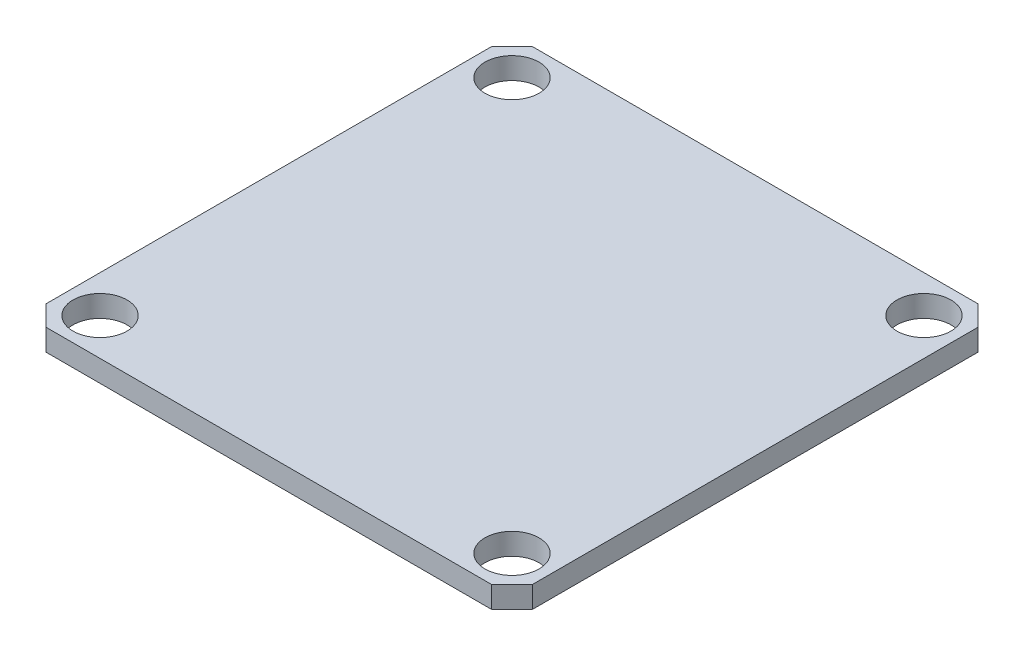
ISO-10303-21;
HEADER;
FILE_DESCRIPTION(('STEP AP214'),'2;1');
FILE_NAME('part.step','',(''),(''),'','','');
FILE_SCHEMA(('AUTOMOTIVE_DESIGN { 1 0 10303 214 1 1 1 1 }'));
ENDSEC;
DATA;
#1=APPLICATION_CONTEXT('core data for automotive mechanical design processes');
#2=APPLICATION_PROTOCOL_DEFINITION('international standard','automotive_design',2000,#1);
#3=PRODUCT_CONTEXT('',#1,'mechanical');
#4=PRODUCT('Part','Part','',(#3));
#5=PRODUCT_RELATED_PRODUCT_CATEGORY('part','',(#4));
#6=PRODUCT_DEFINITION_FORMATION('','',#4);
#7=PRODUCT_DEFINITION_CONTEXT('part definition',#1,'design');
#8=PRODUCT_DEFINITION('design','',#6,#7);
#9=PRODUCT_DEFINITION_SHAPE('','',#8);
#10=(LENGTH_UNIT() NAMED_UNIT(*) SI_UNIT(.MILLI.,.METRE.));
#11=(NAMED_UNIT(*) PLANE_ANGLE_UNIT() SI_UNIT($,.RADIAN.));
#12=(NAMED_UNIT(*) SI_UNIT($,.STERADIAN.) SOLID_ANGLE_UNIT());
#13=UNCERTAINTY_MEASURE_WITH_UNIT(LENGTH_MEASURE(1.E-05),#10,'distance_accuracy_value','');
#14=(GEOMETRIC_REPRESENTATION_CONTEXT(3) GLOBAL_UNCERTAINTY_ASSIGNED_CONTEXT((#13)) GLOBAL_UNIT_ASSIGNED_CONTEXT((#10,
#11,#12)) REPRESENTATION_CONTEXT('',''));
#15=CARTESIAN_POINT('',(0.,0.,0.));
#16=DIRECTION('',(0.,0.,1.));
#17=DIRECTION('',(1.,0.,0.));
#18=AXIS2_PLACEMENT_3D('',#15,#16,#17);
#19=CARTESIAN_POINT('',(0.,1.6,0.));
#20=DIRECTION('',(0.,1.,0.));
#21=DIRECTION('',(0.,0.,1.));
#22=AXIS2_PLACEMENT_3D('',#19,#20,#21);
#23=PLANE('',#22);
#24=CARTESIAN_POINT('',(15.25,1.6,15.25));
#25=DIRECTION('',(0.,1.,0.));
#26=DIRECTION('',(0.,0.,-1.));
#27=AXIS2_PLACEMENT_3D('',#24,#25,#26);
#28=CIRCLE('',#27,2.);
#29=CARTESIAN_POINT('',(15.25,1.6,13.25));
#30=VERTEX_POINT('',#29);
#31=EDGE_CURVE('E227',#30,#30,#28,.T.);
#32=ORIENTED_EDGE('',*,*,#31,.F.);
#33=EDGE_LOOP('',(#32));
#34=FACE_BOUND('',#33,.T.);
#35=CARTESIAN_POINT('',(15.25,1.6,-15.25));
#36=DIRECTION('',(0.,1.,0.));
#37=DIRECTION('',(0.,0.,1.));
#38=AXIS2_PLACEMENT_3D('',#35,#36,#37);
#39=CIRCLE('',#38,2.);
#40=CARTESIAN_POINT('',(15.25,1.6,-13.25));
#41=VERTEX_POINT('',#40);
#42=EDGE_CURVE('E152',#41,#41,#39,.T.);
#43=ORIENTED_EDGE('',*,*,#42,.F.);
#44=EDGE_LOOP('',(#43));
#45=FACE_BOUND('',#44,.T.);
#46=DIRECTION('',(0.707106781186547,0.,0.707106781186547));
#47=VECTOR('',#46,1.);
#48=CARTESIAN_POINT('',(-18.,1.6,16.5));
#49=LINE('',#48,#47);
#50=CARTESIAN_POINT('',(-18.,1.6,16.5));
#51=VERTEX_POINT('',#50);
#52=CARTESIAN_POINT('',(-16.5,1.6,18.));
#53=VERTEX_POINT('',#52);
#54=EDGE_CURVE('E170',#51,#53,#49,.T.);
#55=ORIENTED_EDGE('',*,*,#54,.T.);
#56=DIRECTION('',(1.,0.,0.));
#57=VECTOR('',#56,1.);
#58=CARTESIAN_POINT('',(-16.5,1.6,18.));
#59=LINE('',#58,#57);
#60=CARTESIAN_POINT('',(16.5,1.6,18.));
#61=VERTEX_POINT('',#60);
#62=EDGE_CURVE('E106',#53,#61,#59,.T.);
#63=ORIENTED_EDGE('',*,*,#62,.T.);
#64=DIRECTION('',(0.707106781186547,0.,-0.707106781186547));
#65=VECTOR('',#64,1.);
#66=CARTESIAN_POINT('',(16.5,1.6,18.));
#67=LINE('',#66,#65);
#68=CARTESIAN_POINT('',(18.,1.6,16.5));
#69=VERTEX_POINT('',#68);
#70=EDGE_CURVE('E191',#61,#69,#67,.T.);
#71=ORIENTED_EDGE('',*,*,#70,.T.);
#72=DIRECTION('',(0.,0.,-1.));
#73=VECTOR('',#72,1.);
#74=CARTESIAN_POINT('',(18.,1.6,16.5));
#75=LINE('',#74,#73);
#76=CARTESIAN_POINT('',(18.,1.6,-16.5));
#77=VERTEX_POINT('',#76);
#78=EDGE_CURVE('E205',#69,#77,#75,.T.);
#79=ORIENTED_EDGE('',*,*,#78,.T.);
#80=DIRECTION('',(-0.707106781186547,0.,-0.707106781186547));
#81=VECTOR('',#80,1.);
#82=CARTESIAN_POINT('',(18.,1.6,-16.5));
#83=LINE('',#82,#81);
#84=CARTESIAN_POINT('',(16.5,1.6,-18.));
#85=VERTEX_POINT('',#84);
#86=EDGE_CURVE('E125',#77,#85,#83,.T.);
#87=ORIENTED_EDGE('',*,*,#86,.T.);
#88=DIRECTION('',(-1.,0.,0.));
#89=VECTOR('',#88,1.);
#90=CARTESIAN_POINT('',(16.5,1.6,-18.));
#91=LINE('',#90,#89);
#92=CARTESIAN_POINT('',(-16.5,1.6,-18.));
#93=VERTEX_POINT('',#92);
#94=EDGE_CURVE('E119',#85,#93,#91,.T.);
#95=ORIENTED_EDGE('',*,*,#94,.T.);
#96=DIRECTION('',(-0.707106781186547,0.,0.707106781186547));
#97=VECTOR('',#96,1.);
#98=CARTESIAN_POINT('',(-16.5,1.6,-18.));
#99=LINE('',#98,#97);
#100=CARTESIAN_POINT('',(-18.,1.6,-16.5));
#101=VERTEX_POINT('',#100);
#102=EDGE_CURVE('E123',#93,#101,#99,.T.);
#103=ORIENTED_EDGE('',*,*,#102,.T.);
#104=DIRECTION('',(0.,0.,1.));
#105=VECTOR('',#104,1.);
#106=CARTESIAN_POINT('',(-18.,1.6,-16.5));
#107=LINE('',#106,#105);
#108=EDGE_CURVE('E63',#101,#51,#107,.T.);
#109=ORIENTED_EDGE('',*,*,#108,.T.);
#110=EDGE_LOOP('',(#55,#63,#71,#79,#87,#95,#103,#109));
#111=FACE_BOUND('',#110,.T.);
#112=CARTESIAN_POINT('',(-15.25,1.6,-15.25));
#113=DIRECTION('',(0.,1.,0.));
#114=DIRECTION('',(0.,0.,-1.));
#115=AXIS2_PLACEMENT_3D('',#112,#113,#114);
#116=CIRCLE('',#115,2.);
#117=CARTESIAN_POINT('',(-15.25,1.6,-17.25));
#118=VERTEX_POINT('',#117);
#119=EDGE_CURVE('E219',#118,#118,#116,.T.);
#120=ORIENTED_EDGE('',*,*,#119,.F.);
#121=EDGE_LOOP('',(#120));
#122=FACE_BOUND('',#121,.T.);
#123=CARTESIAN_POINT('',(-15.25,1.6,15.25));
#124=DIRECTION('',(0.,1.,0.));
#125=DIRECTION('',(0.,0.,1.));
#126=AXIS2_PLACEMENT_3D('',#123,#124,#125);
#127=CIRCLE('',#126,2.);
#128=CARTESIAN_POINT('',(-15.25,1.6,17.25));
#129=VERTEX_POINT('',#128);
#130=EDGE_CURVE('E235',#129,#129,#127,.T.);
#131=ORIENTED_EDGE('',*,*,#130,.F.);
#132=EDGE_LOOP('',(#131));
#133=FACE_BOUND('',#132,.T.);
#134=ADVANCED_FACE('F45',(#34,#45,#111,#122,#133),#23,.T.);
#135=CARTESIAN_POINT('',(0.,0.,0.));
#136=DIRECTION('',(0.,1.,0.));
#137=DIRECTION('',(0.,0.,1.));
#138=AXIS2_PLACEMENT_3D('',#135,#136,#137);
#139=PLANE('',#138);
#140=DIRECTION('',(0.707106781186547,0.,0.707106781186547));
#141=VECTOR('',#140,1.);
#142=CARTESIAN_POINT('',(-18.,0.,16.5));
#143=LINE('',#142,#141);
#144=CARTESIAN_POINT('',(-18.,0.,16.5));
#145=VERTEX_POINT('',#144);
#146=CARTESIAN_POINT('',(-16.5,0.,18.));
#147=VERTEX_POINT('',#146);
#148=EDGE_CURVE('E147',#145,#147,#143,.T.);
#149=ORIENTED_EDGE('',*,*,#148,.F.);
#150=DIRECTION('',(0.,0.,1.));
#151=VECTOR('',#150,1.);
#152=CARTESIAN_POINT('',(-18.,0.,-16.5));
#153=LINE('',#152,#151);
#154=CARTESIAN_POINT('',(-18.,0.,-16.5));
#155=VERTEX_POINT('',#154);
#156=EDGE_CURVE('E98',#155,#145,#153,.T.);
#157=ORIENTED_EDGE('',*,*,#156,.F.);
#158=DIRECTION('',(-0.707106781186547,0.,0.707106781186547));
#159=VECTOR('',#158,1.);
#160=CARTESIAN_POINT('',(-16.5,0.,-18.));
#161=LINE('',#160,#159);
#162=CARTESIAN_POINT('',(-16.5,0.,-18.));
#163=VERTEX_POINT('',#162);
#164=EDGE_CURVE('E92',#163,#155,#161,.T.);
#165=ORIENTED_EDGE('',*,*,#164,.F.);
#166=DIRECTION('',(-1.,0.,0.));
#167=VECTOR('',#166,1.);
#168=CARTESIAN_POINT('',(16.5,0.,-18.));
#169=LINE('',#168,#167);
#170=CARTESIAN_POINT('',(16.5,0.,-18.));
#171=VERTEX_POINT('',#170);
#172=EDGE_CURVE('E134',#171,#163,#169,.T.);
#173=ORIENTED_EDGE('',*,*,#172,.F.);
#174=DIRECTION('',(-0.707106781186547,0.,-0.707106781186547));
#175=VECTOR('',#174,1.);
#176=CARTESIAN_POINT('',(18.,0.,-16.5));
#177=LINE('',#176,#175);
#178=CARTESIAN_POINT('',(18.,0.,-16.5));
#179=VERTEX_POINT('',#178);
#180=EDGE_CURVE('E161',#179,#171,#177,.T.);
#181=ORIENTED_EDGE('',*,*,#180,.F.);
#182=DIRECTION('',(0.,0.,-1.));
#183=VECTOR('',#182,1.);
#184=CARTESIAN_POINT('',(18.,0.,16.5));
#185=LINE('',#184,#183);
#186=CARTESIAN_POINT('',(18.,0.,16.5));
#187=VERTEX_POINT('',#186);
#188=EDGE_CURVE('E158',#187,#179,#185,.T.);
#189=ORIENTED_EDGE('',*,*,#188,.F.);
#190=DIRECTION('',(0.707106781186547,0.,-0.707106781186547));
#191=VECTOR('',#190,1.);
#192=CARTESIAN_POINT('',(16.5,0.,18.));
#193=LINE('',#192,#191);
#194=CARTESIAN_POINT('',(16.5,0.,18.));
#195=VERTEX_POINT('',#194);
#196=EDGE_CURVE('E155',#195,#187,#193,.T.);
#197=ORIENTED_EDGE('',*,*,#196,.F.);
#198=DIRECTION('',(1.,0.,0.));
#199=VECTOR('',#198,1.);
#200=CARTESIAN_POINT('',(-16.5,0.,18.));
#201=LINE('',#200,#199);
#202=EDGE_CURVE('E151',#147,#195,#201,.T.);
#203=ORIENTED_EDGE('',*,*,#202,.F.);
#204=EDGE_LOOP('',(#149,#157,#165,#173,#181,#189,#197,#203));
#205=FACE_BOUND('',#204,.T.);
#206=CARTESIAN_POINT('',(15.25,0.,-15.25));
#207=DIRECTION('',(0.,1.,0.));
#208=DIRECTION('',(0.,0.,1.));
#209=AXIS2_PLACEMENT_3D('',#206,#207,#208);
#210=CIRCLE('',#209,2.);
#211=CARTESIAN_POINT('',(15.25,0.,-13.25));
#212=VERTEX_POINT('',#211);
#213=EDGE_CURVE('E215',#212,#212,#210,.T.);
#214=ORIENTED_EDGE('',*,*,#213,.T.);
#215=EDGE_LOOP('',(#214));
#216=FACE_BOUND('',#215,.T.);
#217=CARTESIAN_POINT('',(-15.25,0.,-15.25));
#218=DIRECTION('',(0.,1.,0.));
#219=DIRECTION('',(0.,0.,-1.));
#220=AXIS2_PLACEMENT_3D('',#217,#218,#219);
#221=CIRCLE('',#220,2.);
#222=CARTESIAN_POINT('',(-15.25,0.,-17.25));
#223=VERTEX_POINT('',#222);
#224=EDGE_CURVE('E223',#223,#223,#221,.T.);
#225=ORIENTED_EDGE('',*,*,#224,.T.);
#226=EDGE_LOOP('',(#225));
#227=FACE_BOUND('',#226,.T.);
#228=CARTESIAN_POINT('',(15.25,0.,15.25));
#229=DIRECTION('',(0.,1.,0.));
#230=DIRECTION('',(0.,0.,-1.));
#231=AXIS2_PLACEMENT_3D('',#228,#229,#230);
#232=CIRCLE('',#231,2.);
#233=CARTESIAN_POINT('',(15.25,0.,13.25));
#234=VERTEX_POINT('',#233);
#235=EDGE_CURVE('E231',#234,#234,#232,.T.);
#236=ORIENTED_EDGE('',*,*,#235,.T.);
#237=EDGE_LOOP('',(#236));
#238=FACE_BOUND('',#237,.T.);
#239=CARTESIAN_POINT('',(-15.25,0.,15.25));
#240=DIRECTION('',(0.,1.,0.));
#241=DIRECTION('',(0.,0.,1.));
#242=AXIS2_PLACEMENT_3D('',#239,#240,#241);
#243=CIRCLE('',#242,2.);
#244=CARTESIAN_POINT('',(-15.25,0.,17.25));
#245=VERTEX_POINT('',#244);
#246=EDGE_CURVE('E239',#245,#245,#243,.T.);
#247=ORIENTED_EDGE('',*,*,#246,.T.);
#248=EDGE_LOOP('',(#247));
#249=FACE_BOUND('',#248,.T.);
#250=ADVANCED_FACE('F195',(#205,#216,#227,#238,#249),#139,.F.);
#251=CARTESIAN_POINT('',(-18.,1.6,16.5));
#252=DIRECTION('',(0.707106781186548,0.,-0.707106781186548));
#253=DIRECTION('',(-0.707106781186548,0.,-0.707106781186548));
#254=AXIS2_PLACEMENT_3D('',#251,#252,#253);
#255=PLANE('',#254);
#256=ORIENTED_EDGE('',*,*,#148,.T.);
#257=DIRECTION('',(0.,-1.,0.));
#258=VECTOR('',#257,1.);
#259=CARTESIAN_POINT('',(-16.5,1.6,18.));
#260=LINE('',#259,#258);
#261=EDGE_CURVE('E11',#53,#147,#260,.T.);
#262=ORIENTED_EDGE('',*,*,#261,.F.);
#263=ORIENTED_EDGE('',*,*,#54,.F.);
#264=DIRECTION('',(0.,-1.,0.));
#265=VECTOR('',#264,1.);
#266=CARTESIAN_POINT('',(-18.,1.6,16.5));
#267=LINE('',#266,#265);
#268=EDGE_CURVE('E143',#51,#145,#267,.T.);
#269=ORIENTED_EDGE('',*,*,#268,.T.);
#270=EDGE_LOOP('',(#256,#262,#263,#269));
#271=FACE_BOUND('',#270,.T.);
#272=ADVANCED_FACE('F47',(#271),#255,.F.);
#273=CARTESIAN_POINT('',(-16.5,1.6,18.));
#274=DIRECTION('',(0.,0.,-1.));
#275=DIRECTION('',(-1.,0.,0.));
#276=AXIS2_PLACEMENT_3D('',#273,#274,#275);
#277=PLANE('',#276);
#278=ORIENTED_EDGE('',*,*,#202,.T.);
#279=DIRECTION('',(0.,-1.,0.));
#280=VECTOR('',#279,1.);
#281=CARTESIAN_POINT('',(16.5,1.6,18.));
#282=LINE('',#281,#280);
#283=EDGE_CURVE('E55',#61,#195,#282,.T.);
#284=ORIENTED_EDGE('',*,*,#283,.F.);
#285=ORIENTED_EDGE('',*,*,#62,.F.);
#286=ORIENTED_EDGE('',*,*,#261,.T.);
#287=EDGE_LOOP('',(#278,#284,#285,#286));
#288=FACE_BOUND('',#287,.T.);
#289=ADVANCED_FACE('F275',(#288),#277,.F.);
#290=CARTESIAN_POINT('',(16.5,1.6,18.));
#291=DIRECTION('',(-0.707106781186548,0.,-0.707106781186548));
#292=DIRECTION('',(-0.707106781186548,0.,0.707106781186548));
#293=AXIS2_PLACEMENT_3D('',#290,#291,#292);
#294=PLANE('',#293);
#295=ORIENTED_EDGE('',*,*,#196,.T.);
#296=DIRECTION('',(0.,-1.,0.));
#297=VECTOR('',#296,1.);
#298=CARTESIAN_POINT('',(18.,1.6,16.5));
#299=LINE('',#298,#297);
#300=EDGE_CURVE('E181',#69,#187,#299,.T.);
#301=ORIENTED_EDGE('',*,*,#300,.F.);
#302=ORIENTED_EDGE('',*,*,#70,.F.);
#303=ORIENTED_EDGE('',*,*,#283,.T.);
#304=EDGE_LOOP('',(#295,#301,#302,#303));
#305=FACE_BOUND('',#304,.T.);
#306=ADVANCED_FACE('F189',(#305),#294,.F.);
#307=CARTESIAN_POINT('',(18.,1.6,16.5));
#308=DIRECTION('',(-1.,0.,0.));
#309=DIRECTION('',(0.,0.,1.));
#310=AXIS2_PLACEMENT_3D('',#307,#308,#309);
#311=PLANE('',#310);
#312=ORIENTED_EDGE('',*,*,#188,.T.);
#313=DIRECTION('',(0.,-1.,0.));
#314=VECTOR('',#313,1.);
#315=CARTESIAN_POINT('',(18.,1.6,-16.5));
#316=LINE('',#315,#314);
#317=EDGE_CURVE('E177',#77,#179,#316,.T.);
#318=ORIENTED_EDGE('',*,*,#317,.F.);
#319=ORIENTED_EDGE('',*,*,#78,.F.);
#320=ORIENTED_EDGE('',*,*,#300,.T.);
#321=EDGE_LOOP('',(#312,#318,#319,#320));
#322=FACE_BOUND('',#321,.T.);
#323=ADVANCED_FACE('F200',(#322),#311,.F.);
#324=CARTESIAN_POINT('',(18.,1.6,-16.5));
#325=DIRECTION('',(-0.707106781186548,0.,0.707106781186548));
#326=DIRECTION('',(0.707106781186548,0.,0.707106781186548));
#327=AXIS2_PLACEMENT_3D('',#324,#325,#326);
#328=PLANE('',#327);
#329=ORIENTED_EDGE('',*,*,#180,.T.);
#330=DIRECTION('',(0.,-1.,0.));
#331=VECTOR('',#330,1.);
#332=CARTESIAN_POINT('',(16.5,1.6,-18.));
#333=LINE('',#332,#331);
#334=EDGE_CURVE('E136',#85,#171,#333,.T.);
#335=ORIENTED_EDGE('',*,*,#334,.F.);
#336=ORIENTED_EDGE('',*,*,#86,.F.);
#337=ORIENTED_EDGE('',*,*,#317,.T.);
#338=EDGE_LOOP('',(#329,#335,#336,#337));
#339=FACE_BOUND('',#338,.T.);
#340=ADVANCED_FACE('F203',(#339),#328,.F.);
#341=CARTESIAN_POINT('',(16.5,1.6,-18.));
#342=DIRECTION('',(0.,0.,1.));
#343=DIRECTION('',(1.,0.,0.));
#344=AXIS2_PLACEMENT_3D('',#341,#342,#343);
#345=PLANE('',#344);
#346=ORIENTED_EDGE('',*,*,#172,.T.);
#347=DIRECTION('',(0.,-1.,0.));
#348=VECTOR('',#347,1.);
#349=CARTESIAN_POINT('',(-16.5,1.6,-18.));
#350=LINE('',#349,#348);
#351=EDGE_CURVE('E131',#93,#163,#350,.T.);
#352=ORIENTED_EDGE('',*,*,#351,.F.);
#353=ORIENTED_EDGE('',*,*,#94,.F.);
#354=ORIENTED_EDGE('',*,*,#334,.T.);
#355=EDGE_LOOP('',(#346,#352,#353,#354));
#356=FACE_BOUND('',#355,.T.);
#357=ADVANCED_FACE('F132',(#356),#345,.F.);
#358=CARTESIAN_POINT('',(-16.5,1.6,-18.));
#359=DIRECTION('',(0.707106781186548,0.,0.707106781186548));
#360=DIRECTION('',(0.707106781186548,0.,-0.707106781186548));
#361=AXIS2_PLACEMENT_3D('',#358,#359,#360);
#362=PLANE('',#361);
#363=ORIENTED_EDGE('',*,*,#164,.T.);
#364=DIRECTION('',(0.,-1.,0.));
#365=VECTOR('',#364,1.);
#366=CARTESIAN_POINT('',(-18.,1.6,-16.5));
#367=LINE('',#366,#365);
#368=EDGE_CURVE('E137',#101,#155,#367,.T.);
#369=ORIENTED_EDGE('',*,*,#368,.F.);
#370=ORIENTED_EDGE('',*,*,#102,.F.);
#371=ORIENTED_EDGE('',*,*,#351,.T.);
#372=EDGE_LOOP('',(#363,#369,#370,#371));
#373=FACE_BOUND('',#372,.T.);
#374=ADVANCED_FACE('F139',(#373),#362,.F.);
#375=CARTESIAN_POINT('',(-18.,1.6,-16.5));
#376=DIRECTION('',(1.,0.,0.));
#377=DIRECTION('',(0.,0.,-1.));
#378=AXIS2_PLACEMENT_3D('',#375,#376,#377);
#379=PLANE('',#378);
#380=ORIENTED_EDGE('',*,*,#156,.T.);
#381=ORIENTED_EDGE('',*,*,#268,.F.);
#382=ORIENTED_EDGE('',*,*,#108,.F.);
#383=ORIENTED_EDGE('',*,*,#368,.T.);
#384=EDGE_LOOP('',(#380,#381,#382,#383));
#385=FACE_BOUND('',#384,.T.);
#386=ADVANCED_FACE('F263',(#385),#379,.F.);
#387=CARTESIAN_POINT('',(15.25,1.6,-15.25));
#388=DIRECTION('',(0.,-1.,0.));
#389=DIRECTION('',(0.,0.,-1.));
#390=AXIS2_PLACEMENT_3D('',#387,#388,#389);
#391=CYLINDRICAL_SURFACE('',#390,2.);
#392=ORIENTED_EDGE('',*,*,#42,.T.);
#393=EDGE_LOOP('',(#392));
#394=FACE_BOUND('',#393,.T.);
#395=ORIENTED_EDGE('',*,*,#213,.F.);
#396=EDGE_LOOP('',(#395));
#397=FACE_BOUND('',#396,.T.);
#398=ADVANCED_FACE('F260',(#394,#397),#391,.F.);
#399=CARTESIAN_POINT('',(-15.25,1.6,-15.25));
#400=DIRECTION('',(0.,-1.,0.));
#401=DIRECTION('',(0.,0.,-1.));
#402=AXIS2_PLACEMENT_3D('',#399,#400,#401);
#403=CYLINDRICAL_SURFACE('',#402,2.);
#404=ORIENTED_EDGE('',*,*,#119,.T.);
#405=EDGE_LOOP('',(#404));
#406=FACE_BOUND('',#405,.T.);
#407=ORIENTED_EDGE('',*,*,#224,.F.);
#408=EDGE_LOOP('',(#407));
#409=FACE_BOUND('',#408,.T.);
#410=ADVANCED_FACE('F338',(#406,#409),#403,.F.);
#411=CARTESIAN_POINT('',(15.25,1.6,15.25));
#412=DIRECTION('',(0.,-1.,0.));
#413=DIRECTION('',(0.,0.,-1.));
#414=AXIS2_PLACEMENT_3D('',#411,#412,#413);
#415=CYLINDRICAL_SURFACE('',#414,2.);
#416=ORIENTED_EDGE('',*,*,#31,.T.);
#417=EDGE_LOOP('',(#416));
#418=FACE_BOUND('',#417,.T.);
#419=ORIENTED_EDGE('',*,*,#235,.F.);
#420=EDGE_LOOP('',(#419));
#421=FACE_BOUND('',#420,.T.);
#422=ADVANCED_FACE('F346',(#418,#421),#415,.F.);
#423=CARTESIAN_POINT('',(-15.25,1.6,15.25));
#424=DIRECTION('',(0.,-1.,0.));
#425=DIRECTION('',(0.,0.,-1.));
#426=AXIS2_PLACEMENT_3D('',#423,#424,#425);
#427=CYLINDRICAL_SURFACE('',#426,2.);
#428=ORIENTED_EDGE('',*,*,#130,.T.);
#429=EDGE_LOOP('',(#428));
#430=FACE_BOUND('',#429,.T.);
#431=ORIENTED_EDGE('',*,*,#246,.F.);
#432=EDGE_LOOP('',(#431));
#433=FACE_BOUND('',#432,.T.);
#434=ADVANCED_FACE('F247',(#430,#433),#427,.F.);
#435=CLOSED_SHELL('',(#134,#250,#272,#289,#306,#323,#340,#357,#374,#386,#398,#410,#422,#434));
#436=MANIFOLD_SOLID_BREP('B2',#435);
#437=ADVANCED_BREP_SHAPE_REPRESENTATION('',(#18,#436),#14);
#438=SHAPE_DEFINITION_REPRESENTATION(#9,#437);
ENDSEC;
END-ISO-10303-21;
